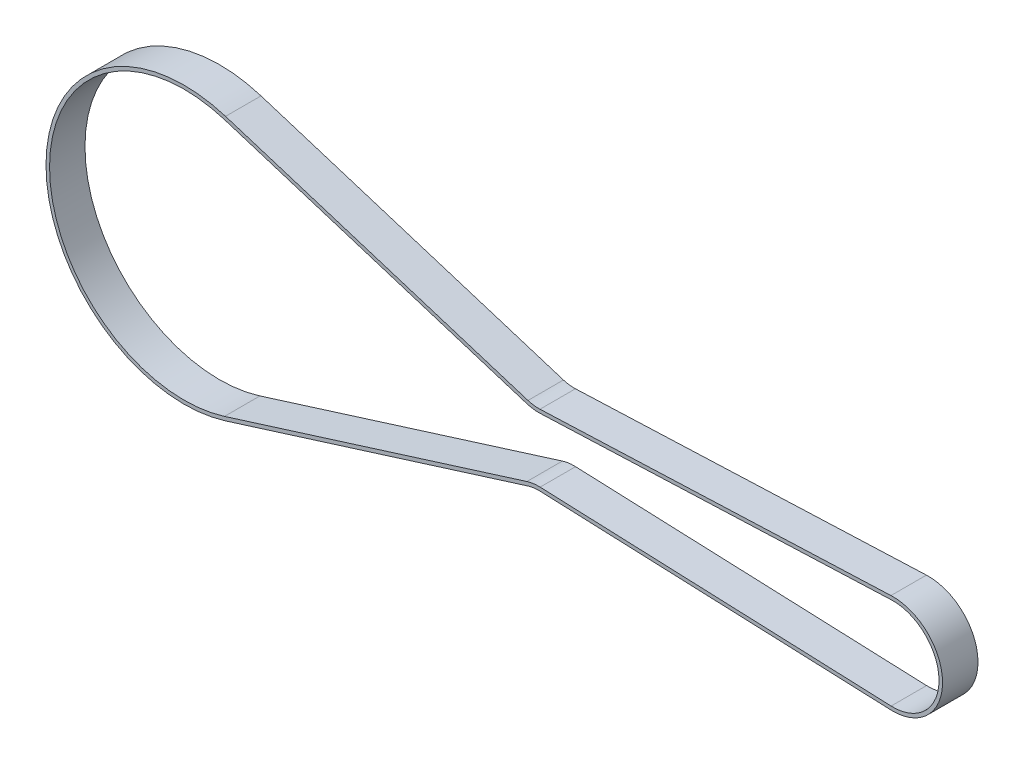
ISO-10303-21;
HEADER;
FILE_DESCRIPTION(('STEP AP214'),'2;1');
FILE_NAME('part.step','',(''),(''),'','','');
FILE_SCHEMA(('AUTOMOTIVE_DESIGN { 1 0 10303 214 1 1 1 1 }'));
ENDSEC;
DATA;
#1=APPLICATION_CONTEXT('core data for automotive mechanical design processes');
#2=APPLICATION_PROTOCOL_DEFINITION('international standard','automotive_design',2000,#1);
#3=PRODUCT_CONTEXT('',#1,'mechanical');
#4=PRODUCT('Part','Part','',(#3));
#5=PRODUCT_RELATED_PRODUCT_CATEGORY('part','',(#4));
#6=PRODUCT_DEFINITION_FORMATION('','',#4);
#7=PRODUCT_DEFINITION_CONTEXT('part definition',#1,'design');
#8=PRODUCT_DEFINITION('design','',#6,#7);
#9=PRODUCT_DEFINITION_SHAPE('','',#8);
#10=(LENGTH_UNIT() NAMED_UNIT(*) SI_UNIT(.MILLI.,.METRE.));
#11=(NAMED_UNIT(*) PLANE_ANGLE_UNIT() SI_UNIT($,.RADIAN.));
#12=(NAMED_UNIT(*) SI_UNIT($,.STERADIAN.) SOLID_ANGLE_UNIT());
#13=UNCERTAINTY_MEASURE_WITH_UNIT(LENGTH_MEASURE(1.E-05),#10,'distance_accuracy_value','');
#14=(GEOMETRIC_REPRESENTATION_CONTEXT(3) GLOBAL_UNCERTAINTY_ASSIGNED_CONTEXT((#13)) GLOBAL_UNIT_ASSIGNED_CONTEXT((#10,
#11,#12)) REPRESENTATION_CONTEXT('',''));
#15=CARTESIAN_POINT('',(0.,0.,0.));
#16=DIRECTION('',(0.,0.,1.));
#17=DIRECTION('',(1.,0.,0.));
#18=AXIS2_PLACEMENT_3D('',#15,#16,#17);
#19=CARTESIAN_POINT('',(-215.63910888329,-21.7183845391613,10.));
#20=DIRECTION('',(0.,0.,1.));
#21=DIRECTION('',(1.,0.,0.));
#22=AXIS2_PLACEMENT_3D('',#19,#20,#21);
#23=PLANE('',#22);
#24=CARTESIAN_POINT('',(-215.63910888329,-21.7183845391613,10.));
#25=DIRECTION('',(0.,0.,1.));
#26=DIRECTION('',(1.,0.,0.));
#27=AXIS2_PLACEMENT_3D('',#24,#25,#26);
#28=CIRCLE('',#27,39.);
#29=CARTESIAN_POINT('',(-203.971893539943,15.4955387440935,10.));
#30=VERTEX_POINT('',#29);
#31=CARTESIAN_POINT('',(-203.971893539943,-58.9323078224161,10.));
#32=VERTEX_POINT('',#31);
#33=EDGE_CURVE('E259',#30,#32,#28,.T.);
#34=ORIENTED_EDGE('',*,*,#33,.T.);
#35=DIRECTION('',(0.954203161109098,0.299159367778121,0.));
#36=VECTOR('',#35,1.);
#37=CARTESIAN_POINT('',(-203.971893539943,-58.9323078224161,10.));
#38=LINE('',#37,#36);
#39=CARTESIAN_POINT('',(-118.630702561073,-32.176352928077,10.));
#40=VERTEX_POINT('',#39);
#41=EDGE_CURVE('E262',#32,#40,#38,.T.);
#42=ORIENTED_EDGE('',*,*,#41,.T.);
#43=CARTESIAN_POINT('',(-115.639108883291,-41.7183845391679,10.));
#44=DIRECTION('',(0.,0.,1.));
#45=DIRECTION('',(1.,0.,0.));
#46=AXIS2_PLACEMENT_3D('',#43,#44,#45);
#47=CIRCLE('',#46,9.99999999999999);
#48=CARTESIAN_POINT('',(-115.237495297654,-31.7264524673496,10.));
#49=VERTEX_POINT('',#48);
#50=EDGE_CURVE('E265',#40,#49,#47,.F.);
#51=ORIENTED_EDGE('',*,*,#50,.T.);
#52=DIRECTION('',(0.999193207181833,-0.0401613585636994,0.));
#53=VECTOR('',#52,1.);
#54=CARTESIAN_POINT('',(-16.201367903182,-35.7070894397203,10.));
#55=LINE('',#54,#53);
#56=CARTESIAN_POINT('',(-16.201367903182,-35.7070894397203,10.));
#57=VERTEX_POINT('',#56);
#58=EDGE_CURVE('E267',#49,#57,#55,.T.);
#59=ORIENTED_EDGE('',*,*,#58,.T.);
#60=CARTESIAN_POINT('',(-15.6391088832902,-21.718384539148,10.));
#61=DIRECTION('',(0.,0.,1.));
#62=DIRECTION('',(1.,0.,0.));
#63=AXIS2_PLACEMENT_3D('',#60,#61,#62);
#64=CIRCLE('',#63,14.0000000000133);
#65=CARTESIAN_POINT('',(-16.2013679031825,-7.72967963858907,10.));
#66=VERTEX_POINT('',#65);
#67=EDGE_CURVE('E269',#57,#66,#64,.T.);
#68=ORIENTED_EDGE('',*,*,#67,.T.);
#69=DIRECTION('',(-0.999193207181833,-0.0401613585636994,0.));
#70=VECTOR('',#69,1.);
#71=CARTESIAN_POINT('',(-16.201367903182,-7.72967963860234,10.));
#72=LINE('',#71,#70);
#73=CARTESIAN_POINT('',(-115.237495297655,-11.710316610973,10.));
#74=VERTEX_POINT('',#73);
#75=EDGE_CURVE('E271',#66,#74,#72,.T.);
#76=ORIENTED_EDGE('',*,*,#75,.T.);
#77=CARTESIAN_POINT('',(-115.639108883291,-1.71838453915467,10.));
#78=DIRECTION('',(0.,0.,1.));
#79=DIRECTION('',(1.,0.,0.));
#80=AXIS2_PLACEMENT_3D('',#77,#78,#79);
#81=CIRCLE('',#80,10.);
#82=CARTESIAN_POINT('',(-118.630702561073,-11.2604161502456,10.));
#83=VERTEX_POINT('',#82);
#84=EDGE_CURVE('E273',#74,#83,#81,.F.);
#85=ORIENTED_EDGE('',*,*,#84,.T.);
#86=DIRECTION('',(-0.954203161109098,0.299159367778121,0.));
#87=VECTOR('',#86,1.);
#88=CARTESIAN_POINT('',(-203.971893539943,15.4955387440935,10.));
#89=LINE('',#88,#87);
#90=EDGE_CURVE('E275',#83,#30,#89,.T.);
#91=ORIENTED_EDGE('',*,*,#90,.T.);
#92=EDGE_LOOP('',(#34,#42,#51,#59,#68,#76,#85,#91));
#93=FACE_BOUND('',#92,.T.);
#94=DIRECTION('',(0.954203161109098,0.299159367778121,0.));
#95=VECTOR('',#94,1.);
#96=CARTESIAN_POINT('',(-204.271052907722,-57.978104661307,10.));
#97=LINE('',#96,#95);
#98=CARTESIAN_POINT('',(-204.271052907722,-57.978104661307,10.));
#99=VERTEX_POINT('',#98);
#100=CARTESIAN_POINT('',(-118.929861928851,-31.2221497669679,10.));
#101=VERTEX_POINT('',#100);
#102=EDGE_CURVE('E202',#99,#101,#97,.T.);
#103=ORIENTED_EDGE('',*,*,#102,.F.);
#104=CARTESIAN_POINT('',(-215.63910888329,-21.7183845391613,10.));
#105=DIRECTION('',(0.,0.,1.));
#106=DIRECTION('',(1.,0.,0.));
#107=AXIS2_PLACEMENT_3D('',#104,#105,#106);
#108=CIRCLE('',#107,38.);
#109=CARTESIAN_POINT('',(-204.271052907722,14.5413355829844,10.));
#110=VERTEX_POINT('',#109);
#111=EDGE_CURVE('E194',#110,#99,#108,.T.);
#112=ORIENTED_EDGE('',*,*,#111,.F.);
#113=DIRECTION('',(-0.954203161109098,0.299159367778121,0.));
#114=VECTOR('',#113,1.);
#115=CARTESIAN_POINT('',(-204.271052907722,14.5413355829844,10.));
#116=LINE('',#115,#114);
#117=CARTESIAN_POINT('',(-118.929861928851,-12.2146193113547,10.));
#118=VERTEX_POINT('',#117);
#119=EDGE_CURVE('E227',#118,#110,#116,.T.);
#120=ORIENTED_EDGE('',*,*,#119,.F.);
#121=CARTESIAN_POINT('',(-115.639108883291,-1.71838453915467,10.));
#122=DIRECTION('',(0.,0.,-1.));
#123=DIRECTION('',(1.,0.,0.));
#124=AXIS2_PLACEMENT_3D('',#121,#122,#123);
#125=CIRCLE('',#124,11.);
#126=CARTESIAN_POINT('',(-115.197333939091,-12.7095098181548,10.));
#127=VERTEX_POINT('',#126);
#128=EDGE_CURVE('E225',#127,#118,#125,.T.);
#129=ORIENTED_EDGE('',*,*,#128,.F.);
#130=DIRECTION('',(-0.999193207181833,-0.0401613585636994,0.));
#131=VECTOR('',#130,1.);
#132=CARTESIAN_POINT('',(-16.1612065446183,-8.72887284578418,10.));
#133=LINE('',#132,#131);
#134=CARTESIAN_POINT('',(-16.1612065446183,-8.72887284578418,10.));
#135=VERTEX_POINT('',#134);
#136=EDGE_CURVE('E223',#135,#127,#133,.T.);
#137=ORIENTED_EDGE('',*,*,#136,.F.);
#138=CARTESIAN_POINT('',(-15.6391088832902,-21.718384539148,10.));
#139=DIRECTION('',(0.,0.,1.));
#140=DIRECTION('',(-1.,0.,0.));
#141=AXIS2_PLACEMENT_3D('',#138,#139,#140);
#142=CIRCLE('',#141,13.0000000000133);
#143=CARTESIAN_POINT('',(-16.1612065446177,-34.7078962325252,10.));
#144=VERTEX_POINT('',#143);
#145=EDGE_CURVE('E221',#144,#135,#142,.T.);
#146=ORIENTED_EDGE('',*,*,#145,.F.);
#147=DIRECTION('',(0.999193207181833,-0.0401613585636994,0.));
#148=VECTOR('',#147,1.);
#149=CARTESIAN_POINT('',(-16.1612065446183,-34.7078962325384,10.));
#150=LINE('',#149,#148);
#151=CARTESIAN_POINT('',(-115.197333939091,-30.7272592601678,10.));
#152=VERTEX_POINT('',#151);
#153=EDGE_CURVE('E217',#152,#144,#150,.T.);
#154=ORIENTED_EDGE('',*,*,#153,.F.);
#155=CARTESIAN_POINT('',(-115.639108883291,-41.7183845391679,10.));
#156=DIRECTION('',(0.,0.,-1.));
#157=DIRECTION('',(-1.,0.,0.));
#158=AXIS2_PLACEMENT_3D('',#155,#156,#157);
#159=CIRCLE('',#158,11.);
#160=EDGE_CURVE('E215',#101,#152,#159,.T.);
#161=ORIENTED_EDGE('',*,*,#160,.F.);
#162=EDGE_LOOP('',(#103,#112,#120,#129,#137,#146,#154,#161));
#163=FACE_BOUND('',#162,.T.);
#164=ADVANCED_FACE('F81',(#93,#163),#23,.T.);
#165=CARTESIAN_POINT('',(-215.63910888329,-21.7183845391613,0.));
#166=DIRECTION('',(0.,0.,1.));
#167=DIRECTION('',(1.,0.,0.));
#168=AXIS2_PLACEMENT_3D('',#165,#166,#167);
#169=PLANE('',#168);
#170=CARTESIAN_POINT('',(-215.63910888329,-21.7183845391613,0.));
#171=DIRECTION('',(0.,0.,1.));
#172=DIRECTION('',(1.,0.,0.));
#173=AXIS2_PLACEMENT_3D('',#170,#171,#172);
#174=CIRCLE('',#173,39.);
#175=CARTESIAN_POINT('',(-203.971893539943,15.4955387440935,0.));
#176=VERTEX_POINT('',#175);
#177=CARTESIAN_POINT('',(-203.971893539943,-58.9323078224161,0.));
#178=VERTEX_POINT('',#177);
#179=EDGE_CURVE('E210',#176,#178,#174,.T.);
#180=ORIENTED_EDGE('',*,*,#179,.F.);
#181=DIRECTION('',(-0.954203161109098,0.299159367778121,0.));
#182=VECTOR('',#181,1.);
#183=CARTESIAN_POINT('',(-203.971893539943,15.4955387440935,0.));
#184=LINE('',#183,#182);
#185=CARTESIAN_POINT('',(-118.630702561073,-11.2604161502456,0.));
#186=VERTEX_POINT('',#185);
#187=EDGE_CURVE('E263',#186,#176,#184,.T.);
#188=ORIENTED_EDGE('',*,*,#187,.F.);
#189=CARTESIAN_POINT('',(-115.639108883291,-1.71838453915467,0.));
#190=DIRECTION('',(0.,0.,1.));
#191=DIRECTION('',(1.,0.,0.));
#192=AXIS2_PLACEMENT_3D('',#189,#190,#191);
#193=CIRCLE('',#192,10.);
#194=CARTESIAN_POINT('',(-115.237495297655,-11.710316610973,0.));
#195=VERTEX_POINT('',#194);
#196=EDGE_CURVE('E290',#195,#186,#193,.F.);
#197=ORIENTED_EDGE('',*,*,#196,.F.);
#198=DIRECTION('',(-0.999193207181833,-0.0401613585636994,0.));
#199=VECTOR('',#198,1.);
#200=CARTESIAN_POINT('',(-16.201367903182,-7.72967963860234,0.));
#201=LINE('',#200,#199);
#202=CARTESIAN_POINT('',(-16.2013679031825,-7.72967963858907,0.));
#203=VERTEX_POINT('',#202);
#204=EDGE_CURVE('E288',#203,#195,#201,.T.);
#205=ORIENTED_EDGE('',*,*,#204,.F.);
#206=CARTESIAN_POINT('',(-15.6391088832902,-21.718384539148,0.));
#207=DIRECTION('',(0.,0.,1.));
#208=DIRECTION('',(1.,0.,0.));
#209=AXIS2_PLACEMENT_3D('',#206,#207,#208);
#210=CIRCLE('',#209,14.0000000000133);
#211=CARTESIAN_POINT('',(-16.201367903182,-35.7070894397203,0.));
#212=VERTEX_POINT('',#211);
#213=EDGE_CURVE('E286',#212,#203,#210,.T.);
#214=ORIENTED_EDGE('',*,*,#213,.F.);
#215=DIRECTION('',(0.999193207181833,-0.0401613585636994,0.));
#216=VECTOR('',#215,1.);
#217=CARTESIAN_POINT('',(-16.201367903182,-35.7070894397203,0.));
#218=LINE('',#217,#216);
#219=CARTESIAN_POINT('',(-115.237495297654,-31.7264524673496,0.));
#220=VERTEX_POINT('',#219);
#221=EDGE_CURVE('E284',#220,#212,#218,.T.);
#222=ORIENTED_EDGE('',*,*,#221,.F.);
#223=CARTESIAN_POINT('',(-115.639108883291,-41.7183845391679,0.));
#224=DIRECTION('',(0.,0.,1.));
#225=DIRECTION('',(1.,0.,0.));
#226=AXIS2_PLACEMENT_3D('',#223,#224,#225);
#227=CIRCLE('',#226,9.99999999999999);
#228=CARTESIAN_POINT('',(-118.630702561073,-32.176352928077,0.));
#229=VERTEX_POINT('',#228);
#230=EDGE_CURVE('E282',#229,#220,#227,.F.);
#231=ORIENTED_EDGE('',*,*,#230,.F.);
#232=DIRECTION('',(0.954203161109098,0.299159367778121,0.));
#233=VECTOR('',#232,1.);
#234=CARTESIAN_POINT('',(-203.971893539943,-58.9323078224161,0.));
#235=LINE('',#234,#233);
#236=EDGE_CURVE('E280',#178,#229,#235,.T.);
#237=ORIENTED_EDGE('',*,*,#236,.F.);
#238=EDGE_LOOP('',(#180,#188,#197,#205,#214,#222,#231,#237));
#239=FACE_BOUND('',#238,.T.);
#240=CARTESIAN_POINT('',(-215.63910888329,-21.7183845391613,0.));
#241=DIRECTION('',(0.,0.,1.));
#242=DIRECTION('',(1.,0.,0.));
#243=AXIS2_PLACEMENT_3D('',#240,#241,#242);
#244=CIRCLE('',#243,38.);
#245=CARTESIAN_POINT('',(-204.271052907722,14.5413355829844,0.));
#246=VERTEX_POINT('',#245);
#247=CARTESIAN_POINT('',(-204.271052907722,-57.978104661307,0.));
#248=VERTEX_POINT('',#247);
#249=EDGE_CURVE('E104',#246,#248,#244,.T.);
#250=ORIENTED_EDGE('',*,*,#249,.T.);
#251=DIRECTION('',(0.954203161109098,0.299159367778121,0.));
#252=VECTOR('',#251,1.);
#253=CARTESIAN_POINT('',(-204.271052907722,-57.978104661307,0.));
#254=LINE('',#253,#252);
#255=CARTESIAN_POINT('',(-118.929861928851,-31.2221497669679,0.));
#256=VERTEX_POINT('',#255);
#257=EDGE_CURVE('E209',#248,#256,#254,.T.);
#258=ORIENTED_EDGE('',*,*,#257,.T.);
#259=CARTESIAN_POINT('',(-115.639108883291,-41.7183845391679,0.));
#260=DIRECTION('',(0.,0.,-1.));
#261=DIRECTION('',(-1.,0.,0.));
#262=AXIS2_PLACEMENT_3D('',#259,#260,#261);
#263=CIRCLE('',#262,11.);
#264=CARTESIAN_POINT('',(-115.197333939091,-30.7272592601678,0.));
#265=VERTEX_POINT('',#264);
#266=EDGE_CURVE('E231',#256,#265,#263,.T.);
#267=ORIENTED_EDGE('',*,*,#266,.T.);
#268=DIRECTION('',(0.999193207181833,-0.0401613585636994,0.));
#269=VECTOR('',#268,1.);
#270=CARTESIAN_POINT('',(-16.1612065446183,-34.7078962325384,0.));
#271=LINE('',#270,#269);
#272=CARTESIAN_POINT('',(-16.1612065446177,-34.7078962325252,0.));
#273=VERTEX_POINT('',#272);
#274=EDGE_CURVE('E234',#265,#273,#271,.T.);
#275=ORIENTED_EDGE('',*,*,#274,.T.);
#276=CARTESIAN_POINT('',(-15.6391088832902,-21.718384539148,0.));
#277=DIRECTION('',(0.,0.,1.));
#278=DIRECTION('',(-1.,0.,0.));
#279=AXIS2_PLACEMENT_3D('',#276,#277,#278);
#280=CIRCLE('',#279,13.0000000000133);
#281=CARTESIAN_POINT('',(-16.1612065446183,-8.72887284578418,0.));
#282=VERTEX_POINT('',#281);
#283=EDGE_CURVE('E237',#273,#282,#280,.T.);
#284=ORIENTED_EDGE('',*,*,#283,.T.);
#285=DIRECTION('',(-0.999193207181833,-0.0401613585636994,0.));
#286=VECTOR('',#285,1.);
#287=CARTESIAN_POINT('',(-16.1612065446183,-8.72887284578418,0.));
#288=LINE('',#287,#286);
#289=CARTESIAN_POINT('',(-115.197333939091,-12.7095098181548,0.));
#290=VERTEX_POINT('',#289);
#291=EDGE_CURVE('E240',#282,#290,#288,.T.);
#292=ORIENTED_EDGE('',*,*,#291,.T.);
#293=CARTESIAN_POINT('',(-115.639108883291,-1.71838453915467,0.));
#294=DIRECTION('',(0.,0.,-1.));
#295=DIRECTION('',(1.,0.,0.));
#296=AXIS2_PLACEMENT_3D('',#293,#294,#295);
#297=CIRCLE('',#296,11.);
#298=CARTESIAN_POINT('',(-118.929861928851,-12.2146193113547,0.));
#299=VERTEX_POINT('',#298);
#300=EDGE_CURVE('E243',#290,#299,#297,.T.);
#301=ORIENTED_EDGE('',*,*,#300,.T.);
#302=DIRECTION('',(-0.954203161109098,0.299159367778121,0.));
#303=VECTOR('',#302,1.);
#304=CARTESIAN_POINT('',(-204.271052907722,14.5413355829844,0.));
#305=LINE('',#304,#303);
#306=EDGE_CURVE('E203',#299,#246,#305,.T.);
#307=ORIENTED_EDGE('',*,*,#306,.T.);
#308=EDGE_LOOP('',(#250,#258,#267,#275,#284,#292,#301,#307));
#309=FACE_BOUND('',#308,.T.);
#310=ADVANCED_FACE('F320',(#239,#309),#169,.F.);
#311=CARTESIAN_POINT('',(-215.63910888329,-21.7183845391613,10.));
#312=DIRECTION('',(0.,0.,-1.));
#313=DIRECTION('',(-1.,0.,0.));
#314=AXIS2_PLACEMENT_3D('',#311,#312,#313);
#315=CYLINDRICAL_SURFACE('',#314,39.);
#316=ORIENTED_EDGE('',*,*,#179,.T.);
#317=DIRECTION('',(0.,0.,-1.));
#318=VECTOR('',#317,1.);
#319=CARTESIAN_POINT('',(-203.971893539943,-58.9323078224161,10.));
#320=LINE('',#319,#318);
#321=EDGE_CURVE('E12',#32,#178,#320,.T.);
#322=ORIENTED_EDGE('',*,*,#321,.F.);
#323=ORIENTED_EDGE('',*,*,#33,.F.);
#324=DIRECTION('',(0.,0.,-1.));
#325=VECTOR('',#324,1.);
#326=CARTESIAN_POINT('',(-203.971893539943,15.4955387440935,10.));
#327=LINE('',#326,#325);
#328=EDGE_CURVE('E277',#30,#176,#327,.T.);
#329=ORIENTED_EDGE('',*,*,#328,.T.);
#330=EDGE_LOOP('',(#316,#322,#323,#329));
#331=FACE_BOUND('',#330,.T.);
#332=ADVANCED_FACE('F83',(#331),#315,.T.);
#333=CARTESIAN_POINT('',(-203.971893539943,-58.9323078224161,10.));
#334=DIRECTION('',(-0.299159367778121,0.954203161109098,0.));
#335=DIRECTION('',(-0.954203161109098,-0.299159367778121,0.));
#336=AXIS2_PLACEMENT_3D('',#333,#334,#335);
#337=PLANE('',#336);
#338=ORIENTED_EDGE('',*,*,#236,.T.);
#339=DIRECTION('',(0.,0.,-1.));
#340=VECTOR('',#339,1.);
#341=CARTESIAN_POINT('',(-118.630702561073,-32.176352928077,10.));
#342=LINE('',#341,#340);
#343=EDGE_CURVE('E89',#40,#229,#342,.T.);
#344=ORIENTED_EDGE('',*,*,#343,.F.);
#345=ORIENTED_EDGE('',*,*,#41,.F.);
#346=ORIENTED_EDGE('',*,*,#321,.T.);
#347=EDGE_LOOP('',(#338,#344,#345,#346));
#348=FACE_BOUND('',#347,.T.);
#349=ADVANCED_FACE('F337',(#348),#337,.F.);
#350=CARTESIAN_POINT('',(-115.639108883291,-41.7183845391679,10.));
#351=DIRECTION('',(0.,0.,-1.));
#352=DIRECTION('',(-1.,0.,0.));
#353=AXIS2_PLACEMENT_3D('',#350,#351,#352);
#354=CYLINDRICAL_SURFACE('',#353,9.99999999999999);
#355=ORIENTED_EDGE('',*,*,#230,.T.);
#356=DIRECTION('',(0.,0.,-1.));
#357=VECTOR('',#356,1.);
#358=CARTESIAN_POINT('',(-115.237495297654,-31.7264524673496,10.));
#359=LINE('',#358,#357);
#360=EDGE_CURVE('E307',#49,#220,#359,.T.);
#361=ORIENTED_EDGE('',*,*,#360,.F.);
#362=ORIENTED_EDGE('',*,*,#50,.F.);
#363=ORIENTED_EDGE('',*,*,#343,.T.);
#364=EDGE_LOOP('',(#355,#361,#362,#363));
#365=FACE_BOUND('',#364,.T.);
#366=ADVANCED_FACE('F314',(#365),#354,.F.);
#367=CARTESIAN_POINT('',(-16.201367903182,-35.7070894397203,10.));
#368=DIRECTION('',(0.0401613585636994,0.999193207181833,0.));
#369=DIRECTION('',(-0.999193207181833,0.0401613585636994,0.));
#370=AXIS2_PLACEMENT_3D('',#367,#368,#369);
#371=PLANE('',#370);
#372=ORIENTED_EDGE('',*,*,#221,.T.);
#373=DIRECTION('',(0.,0.,-1.));
#374=VECTOR('',#373,1.);
#375=CARTESIAN_POINT('',(-16.201367903182,-35.7070894397203,10.));
#376=LINE('',#375,#374);
#377=EDGE_CURVE('E304',#57,#212,#376,.T.);
#378=ORIENTED_EDGE('',*,*,#377,.F.);
#379=ORIENTED_EDGE('',*,*,#58,.F.);
#380=ORIENTED_EDGE('',*,*,#360,.T.);
#381=EDGE_LOOP('',(#372,#378,#379,#380));
#382=FACE_BOUND('',#381,.T.);
#383=ADVANCED_FACE('F326',(#382),#371,.F.);
#384=CARTESIAN_POINT('',(-15.6391088832902,-21.718384539148,10.));
#385=DIRECTION('',(0.,0.,-1.));
#386=DIRECTION('',(-1.,0.,0.));
#387=AXIS2_PLACEMENT_3D('',#384,#385,#386);
#388=CYLINDRICAL_SURFACE('',#387,14.0000000000133);
#389=ORIENTED_EDGE('',*,*,#213,.T.);
#390=DIRECTION('',(0.,0.,-1.));
#391=VECTOR('',#390,1.);
#392=CARTESIAN_POINT('',(-16.2013679031825,-7.72967963858907,10.));
#393=LINE('',#392,#391);
#394=EDGE_CURVE('E301',#66,#203,#393,.T.);
#395=ORIENTED_EDGE('',*,*,#394,.F.);
#396=ORIENTED_EDGE('',*,*,#67,.F.);
#397=ORIENTED_EDGE('',*,*,#377,.T.);
#398=EDGE_LOOP('',(#389,#395,#396,#397));
#399=FACE_BOUND('',#398,.T.);
#400=ADVANCED_FACE('F330',(#399),#388,.T.);
#401=CARTESIAN_POINT('',(-16.201367903182,-7.72967963860234,10.));
#402=DIRECTION('',(0.0401613585636994,-0.999193207181833,0.));
#403=DIRECTION('',(0.999193207181833,0.0401613585636994,0.));
#404=AXIS2_PLACEMENT_3D('',#401,#402,#403);
#405=PLANE('',#404);
#406=ORIENTED_EDGE('',*,*,#204,.T.);
#407=DIRECTION('',(0.,0.,-1.));
#408=VECTOR('',#407,1.);
#409=CARTESIAN_POINT('',(-115.237495297655,-11.710316610973,10.));
#410=LINE('',#409,#408);
#411=EDGE_CURVE('E298',#74,#195,#410,.T.);
#412=ORIENTED_EDGE('',*,*,#411,.F.);
#413=ORIENTED_EDGE('',*,*,#75,.F.);
#414=ORIENTED_EDGE('',*,*,#394,.T.);
#415=EDGE_LOOP('',(#406,#412,#413,#414));
#416=FACE_BOUND('',#415,.T.);
#417=ADVANCED_FACE('F350',(#416),#405,.F.);
#418=CARTESIAN_POINT('',(-115.639108883291,-1.71838453915467,10.));
#419=DIRECTION('',(0.,0.,-1.));
#420=DIRECTION('',(-1.,0.,0.));
#421=AXIS2_PLACEMENT_3D('',#418,#419,#420);
#422=CYLINDRICAL_SURFACE('',#421,10.);
#423=ORIENTED_EDGE('',*,*,#196,.T.);
#424=DIRECTION('',(0.,0.,-1.));
#425=VECTOR('',#424,1.);
#426=CARTESIAN_POINT('',(-118.630702561073,-11.2604161502456,10.));
#427=LINE('',#426,#425);
#428=EDGE_CURVE('E295',#83,#186,#427,.T.);
#429=ORIENTED_EDGE('',*,*,#428,.F.);
#430=ORIENTED_EDGE('',*,*,#84,.F.);
#431=ORIENTED_EDGE('',*,*,#411,.T.);
#432=EDGE_LOOP('',(#423,#429,#430,#431));
#433=FACE_BOUND('',#432,.T.);
#434=ADVANCED_FACE('F348',(#433),#422,.F.);
#435=CARTESIAN_POINT('',(-203.971893539943,15.4955387440935,10.));
#436=DIRECTION('',(-0.299159367778121,-0.954203161109098,0.));
#437=DIRECTION('',(0.954203161109098,-0.299159367778121,0.));
#438=AXIS2_PLACEMENT_3D('',#435,#436,#437);
#439=PLANE('',#438);
#440=ORIENTED_EDGE('',*,*,#187,.T.);
#441=ORIENTED_EDGE('',*,*,#328,.F.);
#442=ORIENTED_EDGE('',*,*,#90,.F.);
#443=ORIENTED_EDGE('',*,*,#428,.T.);
#444=EDGE_LOOP('',(#440,#441,#442,#443));
#445=FACE_BOUND('',#444,.T.);
#446=ADVANCED_FACE('F343',(#445),#439,.F.);
#447=CARTESIAN_POINT('',(-215.63910888329,-21.7183845391613,10.));
#448=DIRECTION('',(0.,0.,-1.));
#449=DIRECTION('',(-1.,0.,0.));
#450=AXIS2_PLACEMENT_3D('',#447,#448,#449);
#451=CYLINDRICAL_SURFACE('',#450,38.);
#452=ORIENTED_EDGE('',*,*,#249,.F.);
#453=DIRECTION('',(0.,0.,-1.));
#454=VECTOR('',#453,1.);
#455=CARTESIAN_POINT('',(-204.271052907722,14.5413355829844,10.));
#456=LINE('',#455,#454);
#457=EDGE_CURVE('E198',#110,#246,#456,.T.);
#458=ORIENTED_EDGE('',*,*,#457,.F.);
#459=ORIENTED_EDGE('',*,*,#111,.T.);
#460=DIRECTION('',(0.,0.,-1.));
#461=VECTOR('',#460,1.);
#462=CARTESIAN_POINT('',(-204.271052907722,-57.978104661307,10.));
#463=LINE('',#462,#461);
#464=EDGE_CURVE('E197',#99,#248,#463,.T.);
#465=ORIENTED_EDGE('',*,*,#464,.T.);
#466=EDGE_LOOP('',(#452,#458,#459,#465));
#467=FACE_BOUND('',#466,.T.);
#468=ADVANCED_FACE('F196',(#467),#451,.F.);
#469=CARTESIAN_POINT('',(-204.271052907722,-57.978104661307,10.));
#470=DIRECTION('',(-0.299159367778121,0.954203161109098,0.));
#471=DIRECTION('',(-0.954203161109098,-0.299159367778121,0.));
#472=AXIS2_PLACEMENT_3D('',#469,#470,#471);
#473=PLANE('',#472);
#474=ORIENTED_EDGE('',*,*,#257,.F.);
#475=ORIENTED_EDGE('',*,*,#464,.F.);
#476=ORIENTED_EDGE('',*,*,#102,.T.);
#477=DIRECTION('',(0.,0.,-1.));
#478=VECTOR('',#477,1.);
#479=CARTESIAN_POINT('',(-118.929861928851,-31.2221497669679,10.));
#480=LINE('',#479,#478);
#481=EDGE_CURVE('E211',#101,#256,#480,.T.);
#482=ORIENTED_EDGE('',*,*,#481,.T.);
#483=EDGE_LOOP('',(#474,#475,#476,#482));
#484=FACE_BOUND('',#483,.T.);
#485=ADVANCED_FACE('F206',(#484),#473,.T.);
#486=CARTESIAN_POINT('',(-115.639108883291,-41.7183845391679,10.));
#487=DIRECTION('',(0.,0.,-1.));
#488=DIRECTION('',(-1.,0.,0.));
#489=AXIS2_PLACEMENT_3D('',#486,#487,#488);
#490=CYLINDRICAL_SURFACE('',#489,11.);
#491=ORIENTED_EDGE('',*,*,#266,.F.);
#492=ORIENTED_EDGE('',*,*,#481,.F.);
#493=ORIENTED_EDGE('',*,*,#160,.T.);
#494=DIRECTION('',(0.,0.,-1.));
#495=VECTOR('',#494,1.);
#496=CARTESIAN_POINT('',(-115.197333939091,-30.7272592601678,10.));
#497=LINE('',#496,#495);
#498=EDGE_CURVE('E256',#152,#265,#497,.T.);
#499=ORIENTED_EDGE('',*,*,#498,.T.);
#500=EDGE_LOOP('',(#491,#492,#493,#499));
#501=FACE_BOUND('',#500,.T.);
#502=ADVANCED_FACE('F375',(#501),#490,.T.);
#503=CARTESIAN_POINT('',(-16.1612065446183,-34.7078962325384,10.));
#504=DIRECTION('',(0.0401613585636994,0.999193207181833,0.));
#505=DIRECTION('',(-0.999193207181833,0.0401613585636994,0.));
#506=AXIS2_PLACEMENT_3D('',#503,#504,#505);
#507=PLANE('',#506);
#508=ORIENTED_EDGE('',*,*,#274,.F.);
#509=ORIENTED_EDGE('',*,*,#498,.F.);
#510=ORIENTED_EDGE('',*,*,#153,.T.);
#511=DIRECTION('',(0.,0.,-1.));
#512=VECTOR('',#511,1.);
#513=CARTESIAN_POINT('',(-16.1612065446177,-34.7078962325252,10.));
#514=LINE('',#513,#512);
#515=EDGE_CURVE('E254',#144,#273,#514,.T.);
#516=ORIENTED_EDGE('',*,*,#515,.T.);
#517=EDGE_LOOP('',(#508,#509,#510,#516));
#518=FACE_BOUND('',#517,.T.);
#519=ADVANCED_FACE('F379',(#518),#507,.T.);
#520=CARTESIAN_POINT('',(-15.6391088832902,-21.718384539148,10.));
#521=DIRECTION('',(0.,0.,-1.));
#522=DIRECTION('',(-1.,0.,0.));
#523=AXIS2_PLACEMENT_3D('',#520,#521,#522);
#524=CYLINDRICAL_SURFACE('',#523,13.0000000000133);
#525=ORIENTED_EDGE('',*,*,#283,.F.);
#526=ORIENTED_EDGE('',*,*,#515,.F.);
#527=ORIENTED_EDGE('',*,*,#145,.T.);
#528=DIRECTION('',(0.,0.,-1.));
#529=VECTOR('',#528,1.);
#530=CARTESIAN_POINT('',(-16.1612065446183,-8.72887284578418,10.));
#531=LINE('',#530,#529);
#532=EDGE_CURVE('E252',#135,#282,#531,.T.);
#533=ORIENTED_EDGE('',*,*,#532,.T.);
#534=EDGE_LOOP('',(#525,#526,#527,#533));
#535=FACE_BOUND('',#534,.T.);
#536=ADVANCED_FACE('F385',(#535),#524,.F.);
#537=CARTESIAN_POINT('',(-16.1612065446183,-8.72887284578418,10.));
#538=DIRECTION('',(0.0401613585636994,-0.999193207181833,0.));
#539=DIRECTION('',(0.999193207181833,0.0401613585636994,0.));
#540=AXIS2_PLACEMENT_3D('',#537,#538,#539);
#541=PLANE('',#540);
#542=ORIENTED_EDGE('',*,*,#291,.F.);
#543=ORIENTED_EDGE('',*,*,#532,.F.);
#544=ORIENTED_EDGE('',*,*,#136,.T.);
#545=DIRECTION('',(0.,0.,-1.));
#546=VECTOR('',#545,1.);
#547=CARTESIAN_POINT('',(-115.197333939091,-12.7095098181548,10.));
#548=LINE('',#547,#546);
#549=EDGE_CURVE('E250',#127,#290,#548,.T.);
#550=ORIENTED_EDGE('',*,*,#549,.T.);
#551=EDGE_LOOP('',(#542,#543,#544,#550));
#552=FACE_BOUND('',#551,.T.);
#553=ADVANCED_FACE('F389',(#552),#541,.T.);
#554=CARTESIAN_POINT('',(-115.639108883291,-1.71838453915467,10.));
#555=DIRECTION('',(0.,0.,-1.));
#556=DIRECTION('',(-1.,0.,0.));
#557=AXIS2_PLACEMENT_3D('',#554,#555,#556);
#558=CYLINDRICAL_SURFACE('',#557,11.);
#559=ORIENTED_EDGE('',*,*,#300,.F.);
#560=ORIENTED_EDGE('',*,*,#549,.F.);
#561=ORIENTED_EDGE('',*,*,#128,.T.);
#562=DIRECTION('',(0.,0.,-1.));
#563=VECTOR('',#562,1.);
#564=CARTESIAN_POINT('',(-118.929861928851,-12.2146193113547,10.));
#565=LINE('',#564,#563);
#566=EDGE_CURVE('E96',#118,#299,#565,.T.);
#567=ORIENTED_EDGE('',*,*,#566,.T.);
#568=EDGE_LOOP('',(#559,#560,#561,#567));
#569=FACE_BOUND('',#568,.T.);
#570=ADVANCED_FACE('F393',(#569),#558,.T.);
#571=CARTESIAN_POINT('',(-204.271052907722,14.5413355829844,10.));
#572=DIRECTION('',(-0.299159367778121,-0.954203161109098,0.));
#573=DIRECTION('',(0.954203161109098,-0.299159367778121,0.));
#574=AXIS2_PLACEMENT_3D('',#571,#572,#573);
#575=PLANE('',#574);
#576=ORIENTED_EDGE('',*,*,#306,.F.);
#577=ORIENTED_EDGE('',*,*,#566,.F.);
#578=ORIENTED_EDGE('',*,*,#119,.T.);
#579=ORIENTED_EDGE('',*,*,#457,.T.);
#580=EDGE_LOOP('',(#576,#577,#578,#579));
#581=FACE_BOUND('',#580,.T.);
#582=ADVANCED_FACE('F397',(#581),#575,.T.);
#583=CLOSED_SHELL('',(#164,#310,#332,#349,#366,#383,#400,#417,#434,#446,#468,#485,#502,#519,
#536,#553,#570,#582));
#584=MANIFOLD_SOLID_BREP('B2',#583);
#585=ADVANCED_BREP_SHAPE_REPRESENTATION('',(#18,#584),#14);
#586=SHAPE_DEFINITION_REPRESENTATION(#9,#585);
ENDSEC;
END-ISO-10303-21;
